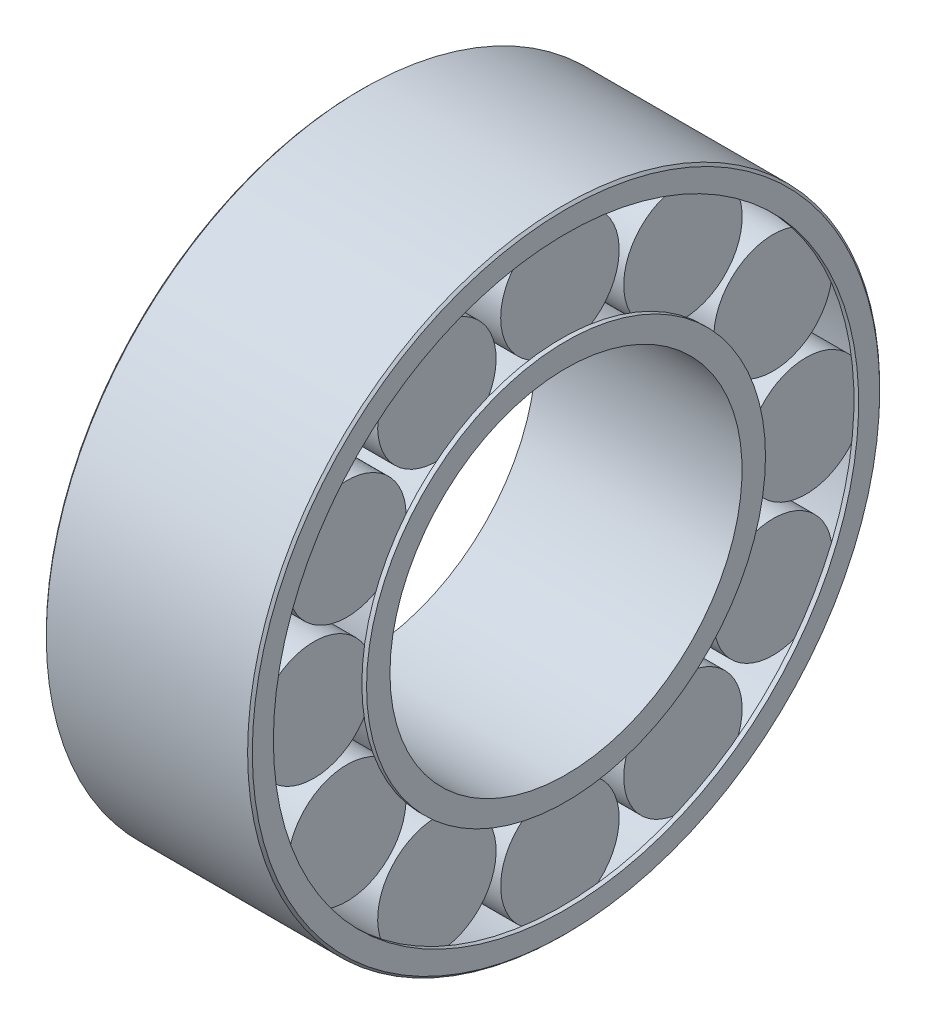
ISO-10303-21;
HEADER;
FILE_DESCRIPTION(('STEP AP214'),'2;1');
FILE_NAME('part.step','',(''),(''),'','','');
FILE_SCHEMA(('AUTOMOTIVE_DESIGN { 1 0 10303 214 1 1 1 1 }'));
ENDSEC;
DATA;
#1=APPLICATION_CONTEXT('core data for automotive mechanical design processes');
#2=APPLICATION_PROTOCOL_DEFINITION('international standard','automotive_design',2000,#1);
#3=PRODUCT_CONTEXT('',#1,'mechanical');
#4=PRODUCT('Part','Part','',(#3));
#5=PRODUCT_RELATED_PRODUCT_CATEGORY('part','',(#4));
#6=PRODUCT_DEFINITION_FORMATION('','',#4);
#7=PRODUCT_DEFINITION_CONTEXT('part definition',#1,'design');
#8=PRODUCT_DEFINITION('design','',#6,#7);
#9=PRODUCT_DEFINITION_SHAPE('','',#8);
#10=(LENGTH_UNIT() NAMED_UNIT(*) SI_UNIT(.MILLI.,.METRE.));
#11=(NAMED_UNIT(*) PLANE_ANGLE_UNIT() SI_UNIT($,.RADIAN.));
#12=(NAMED_UNIT(*) SI_UNIT($,.STERADIAN.) SOLID_ANGLE_UNIT());
#13=UNCERTAINTY_MEASURE_WITH_UNIT(LENGTH_MEASURE(1.E-05),#10,'distance_accuracy_value','');
#14=(GEOMETRIC_REPRESENTATION_CONTEXT(3) GLOBAL_UNCERTAINTY_ASSIGNED_CONTEXT((#13)) GLOBAL_UNIT_ASSIGNED_CONTEXT((#10,
#11,#12)) REPRESENTATION_CONTEXT('',''));
#15=CARTESIAN_POINT('',(0.,0.,0.));
#16=DIRECTION('',(0.,0.,1.));
#17=DIRECTION('',(1.,0.,0.));
#18=AXIS2_PLACEMENT_3D('',#15,#16,#17);
#19=CARTESIAN_POINT('',(1.3,56.4648563267458,-32.5999999999993));
#20=DIRECTION('',(1.,0.,0.));
#21=DIRECTION('',(0.,-0.499999999999989,-0.866025403784445));
#22=AXIS2_PLACEMENT_3D('',#19,#20,#21);
#23=PLANE('',#22);
#24=CARTESIAN_POINT('',(1.3,45.5096349688726,-26.2749999999994));
#25=DIRECTION('',(-1.,0.,0.));
#26=DIRECTION('',(0.,0.499999999999989,0.866025403784445));
#27=AXIS2_PLACEMENT_3D('',#24,#25,#26);
#28=CIRCLE('',#27,12.65);
#29=CARTESIAN_POINT('',(1.3,51.8346349688725,-15.3197786421262));
#30=VERTEX_POINT('',#29);
#31=EDGE_CURVE('E49',#30,#30,#28,.T.);
#32=ORIENTED_EDGE('',*,*,#31,.T.);
#33=EDGE_LOOP('',(#32));
#34=FACE_BOUND('',#33,.T.);
#35=ADVANCED_FACE('F43',(#34),#23,.F.);
#36=CARTESIAN_POINT('',(42.7,56.4648563267458,-32.5999999999993));
#37=DIRECTION('',(-1.,0.,0.));
#38=DIRECTION('',(0.,0.499999999999989,0.866025403784445));
#39=AXIS2_PLACEMENT_3D('',#36,#37,#38);
#40=PLANE('',#39);
#41=CARTESIAN_POINT('',(42.7,45.5096349688726,-26.2749999999994));
#42=DIRECTION('',(-1.,0.,0.));
#43=DIRECTION('',(0.,0.499999999999989,0.866025403784445));
#44=AXIS2_PLACEMENT_3D('',#41,#42,#43);
#45=CIRCLE('',#44,12.65);
#46=CARTESIAN_POINT('',(42.7,51.8346349688725,-15.3197786421262));
#47=VERTEX_POINT('',#46);
#48=EDGE_CURVE('E11',#47,#47,#45,.T.);
#49=ORIENTED_EDGE('',*,*,#48,.F.);
#50=EDGE_LOOP('',(#49));
#51=FACE_BOUND('',#50,.T.);
#52=ADVANCED_FACE('F58',(#51),#40,.F.);
#53=CARTESIAN_POINT('',(1.3,45.5096349688726,-26.2749999999994));
#54=DIRECTION('',(-1.,0.,0.));
#55=DIRECTION('',(0.,0.499999999999989,0.866025403784445));
#56=AXIS2_PLACEMENT_3D('',#53,#54,#55);
#57=CYLINDRICAL_SURFACE('',#56,12.65);
#58=ORIENTED_EDGE('',*,*,#31,.F.);
#59=EDGE_LOOP('',(#58));
#60=FACE_BOUND('',#59,.T.);
#61=ORIENTED_EDGE('',*,*,#48,.T.);
#62=EDGE_LOOP('',(#61));
#63=FACE_BOUND('',#62,.T.);
#64=ADVANCED_FACE('F56',(#60,#63),#57,.T.);
#65=CLOSED_SHELL('',(#35,#52,#64));
#66=MANIFOLD_SOLID_BREP('B2',#65);
#67=CARTESIAN_POINT('',(1.3,32.6000000000007,-56.464856326745));
#68=DIRECTION('',(1.,0.,0.));
#69=DIRECTION('',(0.,-0.866025403784433,-0.50000000000001));
#70=AXIS2_PLACEMENT_3D('',#67,#68,#69);
#71=PLANE('',#70);
#72=CARTESIAN_POINT('',(1.3,26.2750000000005,-45.509634968872));
#73=DIRECTION('',(-1.,0.,0.));
#74=DIRECTION('',(0.,0.866025403784433,0.50000000000001));
#75=AXIS2_PLACEMENT_3D('',#72,#73,#74);
#76=CIRCLE('',#75,12.65);
#77=CARTESIAN_POINT('',(1.3,37.2302213578736,-39.1846349688718));
#78=VERTEX_POINT('',#77);
#79=EDGE_CURVE('E97',#78,#78,#76,.T.);
#80=ORIENTED_EDGE('',*,*,#79,.T.);
#81=EDGE_LOOP('',(#80));
#82=FACE_BOUND('',#81,.T.);
#83=ADVANCED_FACE('F91',(#82),#71,.F.);
#84=CARTESIAN_POINT('',(42.7,32.6000000000007,-56.464856326745));
#85=DIRECTION('',(-1.,0.,0.));
#86=DIRECTION('',(0.,0.866025403784433,0.50000000000001));
#87=AXIS2_PLACEMENT_3D('',#84,#85,#86);
#88=PLANE('',#87);
#89=CARTESIAN_POINT('',(42.7,26.2750000000005,-45.509634968872));
#90=DIRECTION('',(-1.,0.,0.));
#91=DIRECTION('',(0.,0.866025403784433,0.50000000000001));
#92=AXIS2_PLACEMENT_3D('',#89,#90,#91);
#93=CIRCLE('',#92,12.65);
#94=CARTESIAN_POINT('',(42.7,37.2302213578736,-39.1846349688718));
#95=VERTEX_POINT('',#94);
#96=EDGE_CURVE('E42',#95,#95,#93,.T.);
#97=ORIENTED_EDGE('',*,*,#96,.F.);
#98=EDGE_LOOP('',(#97));
#99=FACE_BOUND('',#98,.T.);
#100=ADVANCED_FACE('F106',(#99),#88,.F.);
#101=CARTESIAN_POINT('',(1.3,26.2750000000005,-45.509634968872));
#102=DIRECTION('',(-1.,0.,0.));
#103=DIRECTION('',(0.,0.866025403784433,0.50000000000001));
#104=AXIS2_PLACEMENT_3D('',#101,#102,#103);
#105=CYLINDRICAL_SURFACE('',#104,12.65);
#106=ORIENTED_EDGE('',*,*,#79,.F.);
#107=EDGE_LOOP('',(#106));
#108=FACE_BOUND('',#107,.T.);
#109=ORIENTED_EDGE('',*,*,#96,.T.);
#110=EDGE_LOOP('',(#109));
#111=FACE_BOUND('',#110,.T.);
#112=ADVANCED_FACE('F104',(#108,#111),#105,.T.);
#113=CLOSED_SHELL('',(#83,#100,#112));
#114=MANIFOLD_SOLID_BREP('B6',#113);
#115=CARTESIAN_POINT('',(1.3,6.82933749877717E-13,-65.2));
#116=DIRECTION('',(1.,0.,0.));
#117=DIRECTION('',(0.,-1.,0.));
#118=AXIS2_PLACEMENT_3D('',#115,#116,#117);
#119=PLANE('',#118);
#120=CARTESIAN_POINT('',(1.3,5.5043203306862E-13,-52.55));
#121=DIRECTION('',(-1.,0.,0.));
#122=DIRECTION('',(0.,1.,0.));
#123=AXIS2_PLACEMENT_3D('',#120,#121,#122);
#124=CIRCLE('',#123,12.65);
#125=CARTESIAN_POINT('',(1.3,12.6500000000005,-52.5499999999999));
#126=VERTEX_POINT('',#125);
#127=EDGE_CURVE('E145',#126,#126,#124,.T.);
#128=ORIENTED_EDGE('',*,*,#127,.T.);
#129=EDGE_LOOP('',(#128));
#130=FACE_BOUND('',#129,.T.);
#131=ADVANCED_FACE('F139',(#130),#119,.F.);
#132=CARTESIAN_POINT('',(42.7,6.82933749877717E-13,-65.2));
#133=DIRECTION('',(-1.,0.,0.));
#134=DIRECTION('',(0.,1.,0.));
#135=AXIS2_PLACEMENT_3D('',#132,#133,#134);
#136=PLANE('',#135);
#137=CARTESIAN_POINT('',(42.7,5.5043203306862E-13,-52.55));
#138=DIRECTION('',(-1.,0.,0.));
#139=DIRECTION('',(0.,1.,0.));
#140=AXIS2_PLACEMENT_3D('',#137,#138,#139);
#141=CIRCLE('',#140,12.65);
#142=CARTESIAN_POINT('',(42.7,12.6500000000005,-52.5499999999999));
#143=VERTEX_POINT('',#142);
#144=EDGE_CURVE('E90',#143,#143,#141,.T.);
#145=ORIENTED_EDGE('',*,*,#144,.F.);
#146=EDGE_LOOP('',(#145));
#147=FACE_BOUND('',#146,.T.);
#148=ADVANCED_FACE('F154',(#147),#136,.F.);
#149=CARTESIAN_POINT('',(1.3,5.5043203306862E-13,-52.55));
#150=DIRECTION('',(-1.,0.,0.));
#151=DIRECTION('',(0.,1.,0.));
#152=AXIS2_PLACEMENT_3D('',#149,#150,#151);
#153=CYLINDRICAL_SURFACE('',#152,12.65);
#154=ORIENTED_EDGE('',*,*,#127,.F.);
#155=EDGE_LOOP('',(#154));
#156=FACE_BOUND('',#155,.T.);
#157=ORIENTED_EDGE('',*,*,#144,.T.);
#158=EDGE_LOOP('',(#157));
#159=FACE_BOUND('',#158,.T.);
#160=ADVANCED_FACE('F152',(#156,#159),#153,.T.);
#161=CLOSED_SHELL('',(#131,#148,#160));
#162=MANIFOLD_SOLID_BREP('B37',#161);
#163=CARTESIAN_POINT('',(1.3,-32.5999999999995,-56.4648563267457));
#164=DIRECTION('',(1.,0.,0.));
#165=DIRECTION('',(0.,-0.866025403784443,0.499999999999992));
#166=AXIS2_PLACEMENT_3D('',#163,#164,#165);
#167=PLANE('',#166);
#168=CARTESIAN_POINT('',(1.3,-26.2749999999996,-45.5096349688725));
#169=DIRECTION('',(-1.,0.,0.));
#170=DIRECTION('',(0.,0.866025403784443,-0.499999999999992));
#171=AXIS2_PLACEMENT_3D('',#168,#169,#170);
#172=CIRCLE('',#171,12.65);
#173=CARTESIAN_POINT('',(1.3,-15.3197786421264,-51.8346349688724));
#174=VERTEX_POINT('',#173);
#175=EDGE_CURVE('E193',#174,#174,#172,.T.);
#176=ORIENTED_EDGE('',*,*,#175,.T.);
#177=EDGE_LOOP('',(#176));
#178=FACE_BOUND('',#177,.T.);
#179=ADVANCED_FACE('F187',(#178),#167,.F.);
#180=CARTESIAN_POINT('',(42.7,-32.5999999999995,-56.4648563267457));
#181=DIRECTION('',(-1.,0.,0.));
#182=DIRECTION('',(0.,0.866025403784443,-0.499999999999992));
#183=AXIS2_PLACEMENT_3D('',#180,#181,#182);
#184=PLANE('',#183);
#185=CARTESIAN_POINT('',(42.7,-26.2749999999996,-45.5096349688725));
#186=DIRECTION('',(-1.,0.,0.));
#187=DIRECTION('',(0.,0.866025403784443,-0.499999999999992));
#188=AXIS2_PLACEMENT_3D('',#185,#186,#187);
#189=CIRCLE('',#188,12.65);
#190=CARTESIAN_POINT('',(42.7,-15.3197786421264,-51.8346349688724));
#191=VERTEX_POINT('',#190);
#192=EDGE_CURVE('E138',#191,#191,#189,.T.);
#193=ORIENTED_EDGE('',*,*,#192,.F.);
#194=EDGE_LOOP('',(#193));
#195=FACE_BOUND('',#194,.T.);
#196=ADVANCED_FACE('F202',(#195),#184,.F.);
#197=CARTESIAN_POINT('',(1.3,-26.2749999999996,-45.5096349688725));
#198=DIRECTION('',(-1.,0.,0.));
#199=DIRECTION('',(0.,0.866025403784443,-0.499999999999992));
#200=AXIS2_PLACEMENT_3D('',#197,#198,#199);
#201=CYLINDRICAL_SURFACE('',#200,12.65);
#202=ORIENTED_EDGE('',*,*,#175,.F.);
#203=EDGE_LOOP('',(#202));
#204=FACE_BOUND('',#203,.T.);
#205=ORIENTED_EDGE('',*,*,#192,.T.);
#206=EDGE_LOOP('',(#205));
#207=FACE_BOUND('',#206,.T.);
#208=ADVANCED_FACE('F200',(#204,#207),#201,.T.);
#209=CLOSED_SHELL('',(#179,#196,#208));
#210=MANIFOLD_SOLID_BREP('B85',#209);
#211=CARTESIAN_POINT('',(1.3,-56.4648563267451,-32.6000000000005));
#212=DIRECTION('',(1.,0.,0.));
#213=DIRECTION('',(0.,-0.500000000000007,0.866025403784435));
#214=AXIS2_PLACEMENT_3D('',#211,#212,#213);
#215=PLANE('',#214);
#216=CARTESIAN_POINT('',(1.3,-45.509634968872,-26.2750000000004));
#217=DIRECTION('',(-1.,0.,0.));
#218=DIRECTION('',(0.,0.500000000000007,-0.866025403784435));
#219=AXIS2_PLACEMENT_3D('',#216,#217,#218);
#220=CIRCLE('',#219,12.65);
#221=CARTESIAN_POINT('',(1.3,-39.184634968872,-37.2302213578735));
#222=VERTEX_POINT('',#221);
#223=EDGE_CURVE('E241',#222,#222,#220,.T.);
#224=ORIENTED_EDGE('',*,*,#223,.T.);
#225=EDGE_LOOP('',(#224));
#226=FACE_BOUND('',#225,.T.);
#227=ADVANCED_FACE('F235',(#226),#215,.F.);
#228=CARTESIAN_POINT('',(42.7,-56.4648563267451,-32.6000000000005));
#229=DIRECTION('',(-1.,0.,0.));
#230=DIRECTION('',(0.,0.500000000000007,-0.866025403784435));
#231=AXIS2_PLACEMENT_3D('',#228,#229,#230);
#232=PLANE('',#231);
#233=CARTESIAN_POINT('',(42.7,-45.509634968872,-26.2750000000004));
#234=DIRECTION('',(-1.,0.,0.));
#235=DIRECTION('',(0.,0.500000000000007,-0.866025403784435));
#236=AXIS2_PLACEMENT_3D('',#233,#234,#235);
#237=CIRCLE('',#236,12.65);
#238=CARTESIAN_POINT('',(42.7,-39.184634968872,-37.2302213578735));
#239=VERTEX_POINT('',#238);
#240=EDGE_CURVE('E186',#239,#239,#237,.T.);
#241=ORIENTED_EDGE('',*,*,#240,.F.);
#242=EDGE_LOOP('',(#241));
#243=FACE_BOUND('',#242,.T.);
#244=ADVANCED_FACE('F250',(#243),#232,.F.);
#245=CARTESIAN_POINT('',(1.3,-45.509634968872,-26.2750000000004));
#246=DIRECTION('',(-1.,0.,0.));
#247=DIRECTION('',(0.,0.500000000000007,-0.866025403784435));
#248=AXIS2_PLACEMENT_3D('',#245,#246,#247);
#249=CYLINDRICAL_SURFACE('',#248,12.65);
#250=ORIENTED_EDGE('',*,*,#223,.F.);
#251=EDGE_LOOP('',(#250));
#252=FACE_BOUND('',#251,.T.);
#253=ORIENTED_EDGE('',*,*,#240,.T.);
#254=EDGE_LOOP('',(#253));
#255=FACE_BOUND('',#254,.T.);
#256=ADVANCED_FACE('F248',(#252,#255),#249,.T.);
#257=CLOSED_SHELL('',(#227,#244,#256));
#258=MANIFOLD_SOLID_BREP('B133',#257);
#259=CARTESIAN_POINT('',(1.3,-65.2,0.));
#260=DIRECTION('',(1.,0.,0.));
#261=DIRECTION('',(0.,0.,1.));
#262=AXIS2_PLACEMENT_3D('',#259,#260,#261);
#263=PLANE('',#262);
#264=CARTESIAN_POINT('',(1.3,-52.55,0.));
#265=DIRECTION('',(-1.,0.,0.));
#266=DIRECTION('',(0.,0.,-1.));
#267=AXIS2_PLACEMENT_3D('',#264,#265,#266);
#268=CIRCLE('',#267,12.65);
#269=CARTESIAN_POINT('',(1.3,-52.55,-12.65));
#270=VERTEX_POINT('',#269);
#271=EDGE_CURVE('E289',#270,#270,#268,.T.);
#272=ORIENTED_EDGE('',*,*,#271,.T.);
#273=EDGE_LOOP('',(#272));
#274=FACE_BOUND('',#273,.T.);
#275=ADVANCED_FACE('F283',(#274),#263,.F.);
#276=CARTESIAN_POINT('',(42.7,-65.2,0.));
#277=DIRECTION('',(-1.,0.,0.));
#278=DIRECTION('',(0.,0.,-1.));
#279=AXIS2_PLACEMENT_3D('',#276,#277,#278);
#280=PLANE('',#279);
#281=CARTESIAN_POINT('',(42.7,-52.55,0.));
#282=DIRECTION('',(-1.,0.,0.));
#283=DIRECTION('',(0.,0.,-1.));
#284=AXIS2_PLACEMENT_3D('',#281,#282,#283);
#285=CIRCLE('',#284,12.65);
#286=CARTESIAN_POINT('',(42.7,-52.55,-12.65));
#287=VERTEX_POINT('',#286);
#288=EDGE_CURVE('E234',#287,#287,#285,.T.);
#289=ORIENTED_EDGE('',*,*,#288,.F.);
#290=EDGE_LOOP('',(#289));
#291=FACE_BOUND('',#290,.T.);
#292=ADVANCED_FACE('F298',(#291),#280,.F.);
#293=CARTESIAN_POINT('',(1.3,-52.55,0.));
#294=DIRECTION('',(-1.,0.,0.));
#295=DIRECTION('',(0.,0.,-1.));
#296=AXIS2_PLACEMENT_3D('',#293,#294,#295);
#297=CYLINDRICAL_SURFACE('',#296,12.65);
#298=ORIENTED_EDGE('',*,*,#271,.F.);
#299=EDGE_LOOP('',(#298));
#300=FACE_BOUND('',#299,.T.);
#301=ORIENTED_EDGE('',*,*,#288,.T.);
#302=EDGE_LOOP('',(#301));
#303=FACE_BOUND('',#302,.T.);
#304=ADVANCED_FACE('F296',(#300,#303),#297,.T.);
#305=CLOSED_SHELL('',(#275,#292,#304));
#306=MANIFOLD_SOLID_BREP('B181',#305);
#307=CARTESIAN_POINT('',(1.3,-56.4648563267456,32.5999999999997));
#308=DIRECTION('',(1.,0.,0.));
#309=DIRECTION('',(0.,0.499999999999995,0.866025403784442));
#310=AXIS2_PLACEMENT_3D('',#307,#308,#309);
#311=PLANE('',#310);
#312=CARTESIAN_POINT('',(1.3,-45.5096349688724,26.2749999999997));
#313=DIRECTION('',(-1.,0.,0.));
#314=DIRECTION('',(0.,-0.499999999999995,-0.866025403784442));
#315=AXIS2_PLACEMENT_3D('',#312,#313,#314);
#316=CIRCLE('',#315,12.65);
#317=CARTESIAN_POINT('',(1.3,-51.8346349688724,15.3197786421266));
#318=VERTEX_POINT('',#317);
#319=EDGE_CURVE('E337',#318,#318,#316,.T.);
#320=ORIENTED_EDGE('',*,*,#319,.T.);
#321=EDGE_LOOP('',(#320));
#322=FACE_BOUND('',#321,.T.);
#323=ADVANCED_FACE('F331',(#322),#311,.F.);
#324=CARTESIAN_POINT('',(42.7,-56.4648563267456,32.5999999999997));
#325=DIRECTION('',(-1.,0.,0.));
#326=DIRECTION('',(0.,-0.499999999999995,-0.866025403784442));
#327=AXIS2_PLACEMENT_3D('',#324,#325,#326);
#328=PLANE('',#327);
#329=CARTESIAN_POINT('',(42.7,-45.5096349688724,26.2749999999997));
#330=DIRECTION('',(-1.,0.,0.));
#331=DIRECTION('',(0.,-0.499999999999995,-0.866025403784442));
#332=AXIS2_PLACEMENT_3D('',#329,#330,#331);
#333=CIRCLE('',#332,12.65);
#334=CARTESIAN_POINT('',(42.7,-51.8346349688724,15.3197786421266));
#335=VERTEX_POINT('',#334);
#336=EDGE_CURVE('E282',#335,#335,#333,.T.);
#337=ORIENTED_EDGE('',*,*,#336,.F.);
#338=EDGE_LOOP('',(#337));
#339=FACE_BOUND('',#338,.T.);
#340=ADVANCED_FACE('F346',(#339),#328,.F.);
#341=CARTESIAN_POINT('',(1.3,-45.5096349688724,26.2749999999997));
#342=DIRECTION('',(-1.,0.,0.));
#343=DIRECTION('',(0.,-0.499999999999995,-0.866025403784442));
#344=AXIS2_PLACEMENT_3D('',#341,#342,#343);
#345=CYLINDRICAL_SURFACE('',#344,12.65);
#346=ORIENTED_EDGE('',*,*,#319,.F.);
#347=EDGE_LOOP('',(#346));
#348=FACE_BOUND('',#347,.T.);
#349=ORIENTED_EDGE('',*,*,#336,.T.);
#350=EDGE_LOOP('',(#349));
#351=FACE_BOUND('',#350,.T.);
#352=ADVANCED_FACE('F344',(#348,#351),#345,.T.);
#353=CLOSED_SHELL('',(#323,#340,#352));
#354=MANIFOLD_SOLID_BREP('B229',#353);
#355=CARTESIAN_POINT('',(1.3,-32.6000000000003,56.4648563267453));
#356=DIRECTION('',(1.,0.,0.));
#357=DIRECTION('',(0.,0.866025403784436,0.500000000000004));
#358=AXIS2_PLACEMENT_3D('',#355,#356,#357);
#359=PLANE('',#358);
#360=CARTESIAN_POINT('',(1.3,-26.2750000000002,45.5096349688721));
#361=DIRECTION('',(-1.,0.,0.));
#362=DIRECTION('',(0.,-0.866025403784436,-0.500000000000004));
#363=AXIS2_PLACEMENT_3D('',#360,#361,#362);
#364=CIRCLE('',#363,12.65);
#365=CARTESIAN_POINT('',(1.3,-37.2302213578733,39.1846349688721));
#366=VERTEX_POINT('',#365);
#367=EDGE_CURVE('E385',#366,#366,#364,.T.);
#368=ORIENTED_EDGE('',*,*,#367,.T.);
#369=EDGE_LOOP('',(#368));
#370=FACE_BOUND('',#369,.T.);
#371=ADVANCED_FACE('F379',(#370),#359,.F.);
#372=CARTESIAN_POINT('',(42.7,-32.6000000000003,56.4648563267453));
#373=DIRECTION('',(-1.,0.,0.));
#374=DIRECTION('',(0.,-0.866025403784436,-0.500000000000004));
#375=AXIS2_PLACEMENT_3D('',#372,#373,#374);
#376=PLANE('',#375);
#377=CARTESIAN_POINT('',(42.7,-26.2750000000002,45.5096349688721));
#378=DIRECTION('',(-1.,0.,0.));
#379=DIRECTION('',(0.,-0.866025403784436,-0.500000000000004));
#380=AXIS2_PLACEMENT_3D('',#377,#378,#379);
#381=CIRCLE('',#380,12.65);
#382=CARTESIAN_POINT('',(42.7,-37.2302213578733,39.1846349688721));
#383=VERTEX_POINT('',#382);
#384=EDGE_CURVE('E330',#383,#383,#381,.T.);
#385=ORIENTED_EDGE('',*,*,#384,.F.);
#386=EDGE_LOOP('',(#385));
#387=FACE_BOUND('',#386,.T.);
#388=ADVANCED_FACE('F394',(#387),#376,.F.);
#389=CARTESIAN_POINT('',(1.3,-26.2750000000002,45.5096349688721));
#390=DIRECTION('',(-1.,0.,0.));
#391=DIRECTION('',(0.,-0.866025403784436,-0.500000000000004));
#392=AXIS2_PLACEMENT_3D('',#389,#390,#391);
#393=CYLINDRICAL_SURFACE('',#392,12.65);
#394=ORIENTED_EDGE('',*,*,#367,.F.);
#395=EDGE_LOOP('',(#394));
#396=FACE_BOUND('',#395,.T.);
#397=ORIENTED_EDGE('',*,*,#384,.T.);
#398=EDGE_LOOP('',(#397));
#399=FACE_BOUND('',#398,.T.);
#400=ADVANCED_FACE('F392',(#396,#399),#393,.T.);
#401=CLOSED_SHELL('',(#371,#388,#400));
#402=MANIFOLD_SOLID_BREP('B277',#401);
#403=CARTESIAN_POINT('',(1.3,-2.27644583292572E-13,65.2));
#404=DIRECTION('',(1.,0.,0.));
#405=DIRECTION('',(0.,1.,0.));
#406=AXIS2_PLACEMENT_3D('',#403,#404,#405);
#407=PLANE('',#406);
#408=CARTESIAN_POINT('',(1.3,-1.83477344356207E-13,52.55));
#409=DIRECTION('',(-1.,0.,0.));
#410=DIRECTION('',(0.,-1.,0.));
#411=AXIS2_PLACEMENT_3D('',#408,#409,#410);
#412=CIRCLE('',#411,12.65);
#413=CARTESIAN_POINT('',(1.3,-12.6500000000002,52.55));
#414=VERTEX_POINT('',#413);
#415=EDGE_CURVE('E433',#414,#414,#412,.T.);
#416=ORIENTED_EDGE('',*,*,#415,.T.);
#417=EDGE_LOOP('',(#416));
#418=FACE_BOUND('',#417,.T.);
#419=ADVANCED_FACE('F427',(#418),#407,.F.);
#420=CARTESIAN_POINT('',(42.7,-2.27644583292572E-13,65.2));
#421=DIRECTION('',(-1.,0.,0.));
#422=DIRECTION('',(0.,-1.,0.));
#423=AXIS2_PLACEMENT_3D('',#420,#421,#422);
#424=PLANE('',#423);
#425=CARTESIAN_POINT('',(42.7,-1.83477344356207E-13,52.55));
#426=DIRECTION('',(-1.,0.,0.));
#427=DIRECTION('',(0.,-1.,0.));
#428=AXIS2_PLACEMENT_3D('',#425,#426,#427);
#429=CIRCLE('',#428,12.65);
#430=CARTESIAN_POINT('',(42.7,-12.6500000000002,52.55));
#431=VERTEX_POINT('',#430);
#432=EDGE_CURVE('E378',#431,#431,#429,.T.);
#433=ORIENTED_EDGE('',*,*,#432,.F.);
#434=EDGE_LOOP('',(#433));
#435=FACE_BOUND('',#434,.T.);
#436=ADVANCED_FACE('F442',(#435),#424,.F.);
#437=CARTESIAN_POINT('',(1.3,-1.83477344356207E-13,52.55));
#438=DIRECTION('',(-1.,0.,0.));
#439=DIRECTION('',(0.,-1.,0.));
#440=AXIS2_PLACEMENT_3D('',#437,#438,#439);
#441=CYLINDRICAL_SURFACE('',#440,12.65);
#442=ORIENTED_EDGE('',*,*,#415,.F.);
#443=EDGE_LOOP('',(#442));
#444=FACE_BOUND('',#443,.T.);
#445=ORIENTED_EDGE('',*,*,#432,.T.);
#446=EDGE_LOOP('',(#445));
#447=FACE_BOUND('',#446,.T.);
#448=ADVANCED_FACE('F440',(#444,#447),#441,.T.);
#449=CLOSED_SHELL('',(#419,#436,#448));
#450=MANIFOLD_SOLID_BREP('B325',#449);
#451=CARTESIAN_POINT('',(1.3,32.5999999999999,56.4648563267455));
#452=DIRECTION('',(1.,0.,0.));
#453=DIRECTION('',(0.,0.86602540378444,-0.499999999999998));
#454=AXIS2_PLACEMENT_3D('',#451,#452,#453);
#455=PLANE('',#454);
#456=CARTESIAN_POINT('',(1.3,26.2749999999999,45.5096349688723));
#457=DIRECTION('',(-1.,0.,0.));
#458=DIRECTION('',(0.,-0.86602540378444,0.499999999999998));
#459=AXIS2_PLACEMENT_3D('',#456,#457,#458);
#460=CIRCLE('',#459,12.65);
#461=CARTESIAN_POINT('',(1.3,15.3197786421267,51.8346349688723));
#462=VERTEX_POINT('',#461);
#463=EDGE_CURVE('E481',#462,#462,#460,.T.);
#464=ORIENTED_EDGE('',*,*,#463,.T.);
#465=EDGE_LOOP('',(#464));
#466=FACE_BOUND('',#465,.T.);
#467=ADVANCED_FACE('F475',(#466),#455,.F.);
#468=CARTESIAN_POINT('',(42.7,32.5999999999999,56.4648563267455));
#469=DIRECTION('',(-1.,0.,0.));
#470=DIRECTION('',(0.,-0.86602540378444,0.499999999999998));
#471=AXIS2_PLACEMENT_3D('',#468,#469,#470);
#472=PLANE('',#471);
#473=CARTESIAN_POINT('',(42.7,26.2749999999999,45.5096349688723));
#474=DIRECTION('',(-1.,0.,0.));
#475=DIRECTION('',(0.,-0.86602540378444,0.499999999999998));
#476=AXIS2_PLACEMENT_3D('',#473,#474,#475);
#477=CIRCLE('',#476,12.65);
#478=CARTESIAN_POINT('',(42.7,15.3197786421267,51.8346349688723));
#479=VERTEX_POINT('',#478);
#480=EDGE_CURVE('E426',#479,#479,#477,.T.);
#481=ORIENTED_EDGE('',*,*,#480,.F.);
#482=EDGE_LOOP('',(#481));
#483=FACE_BOUND('',#482,.T.);
#484=ADVANCED_FACE('F490',(#483),#472,.F.);
#485=CARTESIAN_POINT('',(1.3,26.2749999999999,45.5096349688723));
#486=DIRECTION('',(-1.,0.,0.));
#487=DIRECTION('',(0.,-0.86602540378444,0.499999999999998));
#488=AXIS2_PLACEMENT_3D('',#485,#486,#487);
#489=CYLINDRICAL_SURFACE('',#488,12.65);
#490=ORIENTED_EDGE('',*,*,#463,.F.);
#491=EDGE_LOOP('',(#490));
#492=FACE_BOUND('',#491,.T.);
#493=ORIENTED_EDGE('',*,*,#480,.T.);
#494=EDGE_LOOP('',(#493));
#495=FACE_BOUND('',#494,.T.);
#496=ADVANCED_FACE('F488',(#492,#495),#489,.T.);
#497=CLOSED_SHELL('',(#467,#484,#496));
#498=MANIFOLD_SOLID_BREP('B373',#497);
#499=CARTESIAN_POINT('',(1.3,56.4648563267454,32.6000000000001));
#500=DIRECTION('',(1.,0.,0.));
#501=DIRECTION('',(0.,0.500000000000001,-0.866025403784438));
#502=AXIS2_PLACEMENT_3D('',#499,#500,#501);
#503=PLANE('',#502);
#504=CARTESIAN_POINT('',(1.3,45.5096349688722,26.2750000000001));
#505=DIRECTION('',(-1.,0.,0.));
#506=DIRECTION('',(0.,-0.500000000000001,0.866025403784438));
#507=AXIS2_PLACEMENT_3D('',#504,#505,#506);
#508=CIRCLE('',#507,12.65);
#509=CARTESIAN_POINT('',(1.3,39.1846349688722,37.2302213578732));
#510=VERTEX_POINT('',#509);
#511=EDGE_CURVE('E529',#510,#510,#508,.T.);
#512=ORIENTED_EDGE('',*,*,#511,.T.);
#513=EDGE_LOOP('',(#512));
#514=FACE_BOUND('',#513,.T.);
#515=ADVANCED_FACE('F523',(#514),#503,.F.);
#516=CARTESIAN_POINT('',(42.7,56.4648563267454,32.6000000000001));
#517=DIRECTION('',(-1.,0.,0.));
#518=DIRECTION('',(0.,-0.500000000000001,0.866025403784438));
#519=AXIS2_PLACEMENT_3D('',#516,#517,#518);
#520=PLANE('',#519);
#521=CARTESIAN_POINT('',(42.7,45.5096349688722,26.2750000000001));
#522=DIRECTION('',(-1.,0.,0.));
#523=DIRECTION('',(0.,-0.500000000000001,0.866025403784438));
#524=AXIS2_PLACEMENT_3D('',#521,#522,#523);
#525=CIRCLE('',#524,12.65);
#526=CARTESIAN_POINT('',(42.7,39.1846349688722,37.2302213578732));
#527=VERTEX_POINT('',#526);
#528=EDGE_CURVE('E474',#527,#527,#525,.T.);
#529=ORIENTED_EDGE('',*,*,#528,.F.);
#530=EDGE_LOOP('',(#529));
#531=FACE_BOUND('',#530,.T.);
#532=ADVANCED_FACE('F538',(#531),#520,.F.);
#533=CARTESIAN_POINT('',(1.3,45.5096349688722,26.2750000000001));
#534=DIRECTION('',(-1.,0.,0.));
#535=DIRECTION('',(0.,-0.500000000000001,0.866025403784438));
#536=AXIS2_PLACEMENT_3D('',#533,#534,#535);
#537=CYLINDRICAL_SURFACE('',#536,12.65);
#538=ORIENTED_EDGE('',*,*,#511,.F.);
#539=EDGE_LOOP('',(#538));
#540=FACE_BOUND('',#539,.T.);
#541=ORIENTED_EDGE('',*,*,#528,.T.);
#542=EDGE_LOOP('',(#541));
#543=FACE_BOUND('',#542,.T.);
#544=ADVANCED_FACE('F536',(#540,#543),#537,.T.);
#545=CLOSED_SHELL('',(#515,#532,#544));
#546=MANIFOLD_SOLID_BREP('B421',#545);
#547=CARTESIAN_POINT('',(1.3,65.2,0.));
#548=DIRECTION('',(1.,0.,0.));
#549=DIRECTION('',(0.,0.,-1.));
#550=AXIS2_PLACEMENT_3D('',#547,#548,#549);
#551=PLANE('',#550);
#552=CARTESIAN_POINT('',(1.3,52.55,0.));
#553=DIRECTION('',(-1.,0.,0.));
#554=DIRECTION('',(0.,0.,1.));
#555=AXIS2_PLACEMENT_3D('',#552,#553,#554);
#556=CIRCLE('',#555,12.65);
#557=CARTESIAN_POINT('',(1.3,52.55,12.65));
#558=VERTEX_POINT('',#557);
#559=EDGE_CURVE('E577',#558,#558,#556,.T.);
#560=ORIENTED_EDGE('',*,*,#559,.T.);
#561=EDGE_LOOP('',(#560));
#562=FACE_BOUND('',#561,.T.);
#563=ADVANCED_FACE('F571',(#562),#551,.F.);
#564=CARTESIAN_POINT('',(42.7,65.2,0.));
#565=DIRECTION('',(-1.,0.,0.));
#566=DIRECTION('',(0.,0.,1.));
#567=AXIS2_PLACEMENT_3D('',#564,#565,#566);
#568=PLANE('',#567);
#569=CARTESIAN_POINT('',(42.7,52.55,0.));
#570=DIRECTION('',(-1.,0.,0.));
#571=DIRECTION('',(0.,0.,1.));
#572=AXIS2_PLACEMENT_3D('',#569,#570,#571);
#573=CIRCLE('',#572,12.65);
#574=CARTESIAN_POINT('',(42.7,52.55,12.65));
#575=VERTEX_POINT('',#574);
#576=EDGE_CURVE('E522',#575,#575,#573,.T.);
#577=ORIENTED_EDGE('',*,*,#576,.F.);
#578=EDGE_LOOP('',(#577));
#579=FACE_BOUND('',#578,.T.);
#580=ADVANCED_FACE('F586',(#579),#568,.F.);
#581=CARTESIAN_POINT('',(1.3,52.55,0.));
#582=DIRECTION('',(-1.,0.,0.));
#583=DIRECTION('',(0.,0.,1.));
#584=AXIS2_PLACEMENT_3D('',#581,#582,#583);
#585=CYLINDRICAL_SURFACE('',#584,12.65);
#586=ORIENTED_EDGE('',*,*,#559,.F.);
#587=EDGE_LOOP('',(#586));
#588=FACE_BOUND('',#587,.T.);
#589=ORIENTED_EDGE('',*,*,#576,.T.);
#590=EDGE_LOOP('',(#589));
#591=FACE_BOUND('',#590,.T.);
#592=ADVANCED_FACE('F584',(#588,#591),#585,.T.);
#593=CLOSED_SHELL('',(#563,#580,#592));
#594=MANIFOLD_SOLID_BREP('B469',#593);
#595=CARTESIAN_POINT('',(0.,67.5,0.));
#596=DIRECTION('',(1.,0.,0.));
#597=DIRECTION('',(0.,0.,-1.));
#598=AXIS2_PLACEMENT_3D('',#595,#596,#597);
#599=PLANE('',#598);
#600=CARTESIAN_POINT('',(0.,0.,0.));
#601=DIRECTION('',(1.,0.,0.));
#602=DIRECTION('',(0.,0.,-1.));
#603=AXIS2_PLACEMENT_3D('',#600,#601,#602);
#604=CIRCLE('',#603,67.);
#605=CARTESIAN_POINT('',(0.,0.,-67.));
#606=VERTEX_POINT('',#605);
#607=EDGE_CURVE('E570',#606,#606,#604,.F.);
#608=ORIENTED_EDGE('',*,*,#607,.T.);
#609=EDGE_LOOP('',(#608));
#610=FACE_BOUND('',#609,.T.);
#611=CARTESIAN_POINT('',(0.,0.,0.));
#612=DIRECTION('',(-1.,0.,0.));
#613=DIRECTION('',(0.,0.,1.));
#614=AXIS2_PLACEMENT_3D('',#611,#612,#613);
#615=CIRCLE('',#614,62.5);
#616=CARTESIAN_POINT('',(0.,0.,62.5));
#617=VERTEX_POINT('',#616);
#618=EDGE_CURVE('E640',#617,#617,#615,.T.);
#619=ORIENTED_EDGE('',*,*,#618,.F.);
#620=EDGE_LOOP('',(#619));
#621=FACE_BOUND('',#620,.T.);
#622=ADVANCED_FACE('F619',(#610,#621),#599,.F.);
#623=CARTESIAN_POINT('',(0.,0.,0.));
#624=DIRECTION('',(-1.,0.,0.));
#625=DIRECTION('',(0.,0.,1.));
#626=AXIS2_PLACEMENT_3D('',#623,#624,#625);
#627=CYLINDRICAL_SURFACE('',#626,62.5);
#628=CARTESIAN_POINT('',(0.999999999999997,0.,0.));
#629=DIRECTION('',(-1.,0.,0.));
#630=DIRECTION('',(0.,0.,1.));
#631=AXIS2_PLACEMENT_3D('',#628,#629,#630);
#632=CIRCLE('',#631,62.5);
#633=CARTESIAN_POINT('',(0.999999999999997,0.,62.5));
#634=VERTEX_POINT('',#633);
#635=EDGE_CURVE('E643',#634,#634,#632,.T.);
#636=ORIENTED_EDGE('',*,*,#635,.F.);
#637=EDGE_LOOP('',(#636));
#638=FACE_BOUND('',#637,.T.);
#639=ORIENTED_EDGE('',*,*,#618,.T.);
#640=EDGE_LOOP('',(#639));
#641=FACE_BOUND('',#640,.T.);
#642=ADVANCED_FACE('F682',(#638,#641),#627,.F.);
#643=CARTESIAN_POINT('',(0.999999999999997,62.5,0.));
#644=DIRECTION('',(-1.,0.,0.));
#645=DIRECTION('',(0.,0.,1.));
#646=AXIS2_PLACEMENT_3D('',#643,#644,#645);
#647=PLANE('',#646);
#648=CARTESIAN_POINT('',(0.999999999999998,0.,0.));
#649=DIRECTION('',(-1.,0.,0.));
#650=DIRECTION('',(0.,0.,1.));
#651=AXIS2_PLACEMENT_3D('',#648,#649,#650);
#652=CIRCLE('',#651,65.5);
#653=CARTESIAN_POINT('',(0.999999999999998,0.,65.5));
#654=VERTEX_POINT('',#653);
#655=EDGE_CURVE('E646',#654,#654,#652,.T.);
#656=ORIENTED_EDGE('',*,*,#655,.F.);
#657=EDGE_LOOP('',(#656));
#658=FACE_BOUND('',#657,.T.);
#659=ORIENTED_EDGE('',*,*,#635,.T.);
#660=EDGE_LOOP('',(#659));
#661=FACE_BOUND('',#660,.T.);
#662=ADVANCED_FACE('F676',(#658,#661),#647,.F.);
#663=CARTESIAN_POINT('',(0.,0.,0.));
#664=DIRECTION('',(-1.,0.,0.));
#665=DIRECTION('',(0.,0.,1.));
#666=AXIS2_PLACEMENT_3D('',#663,#664,#665);
#667=CYLINDRICAL_SURFACE('',#666,65.5);
#668=CARTESIAN_POINT('',(43.,0.,0.));
#669=DIRECTION('',(-1.,0.,0.));
#670=DIRECTION('',(0.,0.,1.));
#671=AXIS2_PLACEMENT_3D('',#668,#669,#670);
#672=CIRCLE('',#671,65.5);
#673=CARTESIAN_POINT('',(43.,0.,65.5));
#674=VERTEX_POINT('',#673);
#675=EDGE_CURVE('E649',#674,#674,#672,.T.);
#676=ORIENTED_EDGE('',*,*,#675,.F.);
#677=EDGE_LOOP('',(#676));
#678=FACE_BOUND('',#677,.T.);
#679=ORIENTED_EDGE('',*,*,#655,.T.);
#680=EDGE_LOOP('',(#679));
#681=FACE_BOUND('',#680,.T.);
#682=ADVANCED_FACE('F670',(#678,#681),#667,.F.);
#683=CARTESIAN_POINT('',(43.,65.5,0.));
#684=DIRECTION('',(1.,0.,0.));
#685=DIRECTION('',(0.,0.,-1.));
#686=AXIS2_PLACEMENT_3D('',#683,#684,#685);
#687=PLANE('',#686);
#688=CARTESIAN_POINT('',(43.,0.,0.));
#689=DIRECTION('',(-1.,0.,0.));
#690=DIRECTION('',(0.,0.,1.));
#691=AXIS2_PLACEMENT_3D('',#688,#689,#690);
#692=CIRCLE('',#691,62.5);
#693=CARTESIAN_POINT('',(43.,0.,62.5));
#694=VERTEX_POINT('',#693);
#695=EDGE_CURVE('E652',#694,#694,#692,.T.);
#696=ORIENTED_EDGE('',*,*,#695,.F.);
#697=EDGE_LOOP('',(#696));
#698=FACE_BOUND('',#697,.T.);
#699=ORIENTED_EDGE('',*,*,#675,.T.);
#700=EDGE_LOOP('',(#699));
#701=FACE_BOUND('',#700,.T.);
#702=ADVANCED_FACE('F664',(#698,#701),#687,.F.);
#703=CARTESIAN_POINT('',(0.,0.,0.));
#704=DIRECTION('',(-1.,0.,0.));
#705=DIRECTION('',(0.,0.,1.));
#706=AXIS2_PLACEMENT_3D('',#703,#704,#705);
#707=CYLINDRICAL_SURFACE('',#706,62.5);
#708=CARTESIAN_POINT('',(44.,0.,0.));
#709=DIRECTION('',(-1.,0.,0.));
#710=DIRECTION('',(0.,0.,1.));
#711=AXIS2_PLACEMENT_3D('',#708,#709,#710);
#712=CIRCLE('',#711,62.5);
#713=CARTESIAN_POINT('',(44.,0.,62.5));
#714=VERTEX_POINT('',#713);
#715=EDGE_CURVE('E655',#714,#714,#712,.T.);
#716=ORIENTED_EDGE('',*,*,#715,.F.);
#717=EDGE_LOOP('',(#716));
#718=FACE_BOUND('',#717,.T.);
#719=ORIENTED_EDGE('',*,*,#695,.T.);
#720=EDGE_LOOP('',(#719));
#721=FACE_BOUND('',#720,.T.);
#722=ADVANCED_FACE('F661',(#718,#721),#707,.F.);
#723=CARTESIAN_POINT('',(44.,62.5,0.));
#724=DIRECTION('',(-1.,0.,0.));
#725=DIRECTION('',(0.,0.,1.));
#726=AXIS2_PLACEMENT_3D('',#723,#724,#725);
#727=PLANE('',#726);
#728=CARTESIAN_POINT('',(44.,0.,0.));
#729=DIRECTION('',(-1.,0.,0.));
#730=DIRECTION('',(0.,0.,1.));
#731=AXIS2_PLACEMENT_3D('',#728,#729,#730);
#732=CIRCLE('',#731,67.);
#733=CARTESIAN_POINT('',(44.,0.,67.));
#734=VERTEX_POINT('',#733);
#735=EDGE_CURVE('E627',#734,#734,#732,.F.);
#736=ORIENTED_EDGE('',*,*,#735,.T.);
#737=EDGE_LOOP('',(#736));
#738=FACE_BOUND('',#737,.T.);
#739=ORIENTED_EDGE('',*,*,#715,.T.);
#740=EDGE_LOOP('',(#739));
#741=FACE_BOUND('',#740,.T.);
#742=ADVANCED_FACE('F659',(#738,#741),#727,.F.);
#743=CARTESIAN_POINT('',(0.,0.,0.));
#744=DIRECTION('',(-1.,0.,0.));
#745=DIRECTION('',(0.,0.,1.));
#746=AXIS2_PLACEMENT_3D('',#743,#744,#745);
#747=CYLINDRICAL_SURFACE('',#746,67.5);
#748=CARTESIAN_POINT('',(43.5,0.,0.));
#749=DIRECTION('',(-1.,0.,0.));
#750=DIRECTION('',(0.,0.,1.));
#751=AXIS2_PLACEMENT_3D('',#748,#749,#750);
#752=CIRCLE('',#751,67.5);
#753=CARTESIAN_POINT('',(43.5,0.,67.5));
#754=VERTEX_POINT('',#753);
#755=EDGE_CURVE('E631',#754,#754,#752,.T.);
#756=ORIENTED_EDGE('',*,*,#755,.T.);
#757=EDGE_LOOP('',(#756));
#758=FACE_BOUND('',#757,.T.);
#759=CARTESIAN_POINT('',(0.500000000000015,0.,0.));
#760=DIRECTION('',(1.,0.,0.));
#761=DIRECTION('',(0.,0.,-1.));
#762=AXIS2_PLACEMENT_3D('',#759,#760,#761);
#763=CIRCLE('',#762,67.5);
#764=CARTESIAN_POINT('',(0.500000000000015,0.,-67.5));
#765=VERTEX_POINT('',#764);
#766=EDGE_CURVE('E635',#765,#765,#763,.T.);
#767=ORIENTED_EDGE('',*,*,#766,.T.);
#768=EDGE_LOOP('',(#767));
#769=FACE_BOUND('',#768,.T.);
#770=ADVANCED_FACE('F702',(#758,#769),#747,.T.);
#771=CARTESIAN_POINT('',(43.5,0.,0.));
#772=DIRECTION('',(-1.,0.,0.));
#773=DIRECTION('',(0.,0.,1.));
#774=AXIS2_PLACEMENT_3D('',#771,#772,#773);
#775=CONICAL_SURFACE('',#774,67.5,0.785398163397448);
#776=ORIENTED_EDGE('',*,*,#735,.F.);
#777=EDGE_LOOP('',(#776));
#778=FACE_BOUND('',#777,.T.);
#779=ORIENTED_EDGE('',*,*,#755,.F.);
#780=EDGE_LOOP('',(#779));
#781=FACE_BOUND('',#780,.T.);
#782=ADVANCED_FACE('F698',(#778,#781),#775,.T.);
#783=CARTESIAN_POINT('',(0.,0.,0.));
#784=DIRECTION('',(1.,0.,0.));
#785=DIRECTION('',(0.,0.,-1.));
#786=AXIS2_PLACEMENT_3D('',#783,#784,#785);
#787=CONICAL_SURFACE('',#786,67.,0.785398163397462);
#788=ORIENTED_EDGE('',*,*,#766,.F.);
#789=EDGE_LOOP('',(#788));
#790=FACE_BOUND('',#789,.T.);
#791=ORIENTED_EDGE('',*,*,#607,.F.);
#792=EDGE_LOOP('',(#791));
#793=FACE_BOUND('',#792,.T.);
#794=ADVANCED_FACE('F622',(#790,#793),#787,.T.);
#795=CLOSED_SHELL('',(#622,#642,#662,#682,#702,#722,#742,#770,#782,#794));
#796=MANIFOLD_SOLID_BREP('B517',#795);
#797=CARTESIAN_POINT('',(0.,37.6,0.));
#798=DIRECTION('',(1.,0.,0.));
#799=DIRECTION('',(0.,0.,-1.));
#800=AXIS2_PLACEMENT_3D('',#797,#798,#799);
#801=PLANE('',#800);
#802=CARTESIAN_POINT('',(0.,0.,0.));
#803=DIRECTION('',(-1.,0.,0.));
#804=DIRECTION('',(0.,0.,1.));
#805=AXIS2_PLACEMENT_3D('',#802,#803,#804);
#806=CIRCLE('',#805,37.6);
#807=CARTESIAN_POINT('',(0.,0.,37.6));
#808=VERTEX_POINT('',#807);
#809=EDGE_CURVE('E804',#808,#808,#806,.T.);
#810=ORIENTED_EDGE('',*,*,#809,.F.);
#811=EDGE_LOOP('',(#810));
#812=FACE_BOUND('',#811,.T.);
#813=CARTESIAN_POINT('',(0.,0.,0.));
#814=DIRECTION('',(-1.,0.,0.));
#815=DIRECTION('',(0.,0.,1.));
#816=AXIS2_PLACEMENT_3D('',#813,#814,#815);
#817=CIRCLE('',#816,42.6);
#818=CARTESIAN_POINT('',(0.,0.,42.6));
#819=VERTEX_POINT('',#818);
#820=EDGE_CURVE('E618',#819,#819,#817,.T.);
#821=ORIENTED_EDGE('',*,*,#820,.T.);
#822=EDGE_LOOP('',(#821));
#823=FACE_BOUND('',#822,.T.);
#824=ADVANCED_FACE('F776',(#812,#823),#801,.F.);
#825=CARTESIAN_POINT('',(0.,0.,0.));
#826=DIRECTION('',(-1.,0.,0.));
#827=DIRECTION('',(0.,0.,1.));
#828=AXIS2_PLACEMENT_3D('',#825,#826,#827);
#829=CYLINDRICAL_SURFACE('',#828,42.6);
#830=ORIENTED_EDGE('',*,*,#820,.F.);
#831=EDGE_LOOP('',(#830));
#832=FACE_BOUND('',#831,.T.);
#833=CARTESIAN_POINT('',(1.,0.,0.));
#834=DIRECTION('',(-1.,0.,0.));
#835=DIRECTION('',(0.,0.,1.));
#836=AXIS2_PLACEMENT_3D('',#833,#834,#835);
#837=CIRCLE('',#836,42.6);
#838=CARTESIAN_POINT('',(1.,0.,42.6));
#839=VERTEX_POINT('',#838);
#840=EDGE_CURVE('E782',#839,#839,#837,.T.);
#841=ORIENTED_EDGE('',*,*,#840,.T.);
#842=EDGE_LOOP('',(#841));
#843=FACE_BOUND('',#842,.T.);
#844=ADVANCED_FACE('F811',(#832,#843),#829,.T.);
#845=CARTESIAN_POINT('',(1.,42.6,0.));
#846=DIRECTION('',(-1.,0.,0.));
#847=DIRECTION('',(0.,0.,1.));
#848=AXIS2_PLACEMENT_3D('',#845,#846,#847);
#849=PLANE('',#848);
#850=ORIENTED_EDGE('',*,*,#840,.F.);
#851=EDGE_LOOP('',(#850));
#852=FACE_BOUND('',#851,.T.);
#853=CARTESIAN_POINT('',(1.,0.,0.));
#854=DIRECTION('',(-1.,0.,0.));
#855=DIRECTION('',(0.,0.,1.));
#856=AXIS2_PLACEMENT_3D('',#853,#854,#855);
#857=CIRCLE('',#856,39.6);
#858=CARTESIAN_POINT('',(1.,0.,39.6));
#859=VERTEX_POINT('',#858);
#860=EDGE_CURVE('E786',#859,#859,#857,.T.);
#861=ORIENTED_EDGE('',*,*,#860,.T.);
#862=EDGE_LOOP('',(#861));
#863=FACE_BOUND('',#862,.T.);
#864=ADVANCED_FACE('F815',(#852,#863),#849,.F.);
#865=CARTESIAN_POINT('',(0.,0.,0.));
#866=DIRECTION('',(-1.,0.,0.));
#867=DIRECTION('',(0.,0.,1.));
#868=AXIS2_PLACEMENT_3D('',#865,#866,#867);
#869=CYLINDRICAL_SURFACE('',#868,39.6);
#870=ORIENTED_EDGE('',*,*,#860,.F.);
#871=EDGE_LOOP('',(#870));
#872=FACE_BOUND('',#871,.T.);
#873=CARTESIAN_POINT('',(43.,0.,0.));
#874=DIRECTION('',(-1.,0.,0.));
#875=DIRECTION('',(0.,0.,1.));
#876=AXIS2_PLACEMENT_3D('',#873,#874,#875);
#877=CIRCLE('',#876,39.6);
#878=CARTESIAN_POINT('',(43.,0.,39.6));
#879=VERTEX_POINT('',#878);
#880=EDGE_CURVE('E790',#879,#879,#877,.T.);
#881=ORIENTED_EDGE('',*,*,#880,.T.);
#882=EDGE_LOOP('',(#881));
#883=FACE_BOUND('',#882,.T.);
#884=ADVANCED_FACE('F820',(#872,#883),#869,.T.);
#885=CARTESIAN_POINT('',(43.,39.6,0.));
#886=DIRECTION('',(1.,0.,0.));
#887=DIRECTION('',(0.,0.,-1.));
#888=AXIS2_PLACEMENT_3D('',#885,#886,#887);
#889=PLANE('',#888);
#890=ORIENTED_EDGE('',*,*,#880,.F.);
#891=EDGE_LOOP('',(#890));
#892=FACE_BOUND('',#891,.T.);
#893=CARTESIAN_POINT('',(43.,0.,0.));
#894=DIRECTION('',(-1.,0.,0.));
#895=DIRECTION('',(0.,0.,1.));
#896=AXIS2_PLACEMENT_3D('',#893,#894,#895);
#897=CIRCLE('',#896,42.6);
#898=CARTESIAN_POINT('',(43.,0.,42.6));
#899=VERTEX_POINT('',#898);
#900=EDGE_CURVE('E795',#899,#899,#897,.T.);
#901=ORIENTED_EDGE('',*,*,#900,.T.);
#902=EDGE_LOOP('',(#901));
#903=FACE_BOUND('',#902,.T.);
#904=ADVANCED_FACE('F826',(#892,#903),#889,.F.);
#905=CARTESIAN_POINT('',(0.,0.,0.));
#906=DIRECTION('',(-1.,0.,0.));
#907=DIRECTION('',(0.,0.,1.));
#908=AXIS2_PLACEMENT_3D('',#905,#906,#907);
#909=CYLINDRICAL_SURFACE('',#908,42.6);
#910=ORIENTED_EDGE('',*,*,#900,.F.);
#911=EDGE_LOOP('',(#910));
#912=FACE_BOUND('',#911,.T.);
#913=CARTESIAN_POINT('',(44.,0.,0.));
#914=DIRECTION('',(-1.,0.,0.));
#915=DIRECTION('',(0.,0.,1.));
#916=AXIS2_PLACEMENT_3D('',#913,#914,#915);
#917=CIRCLE('',#916,42.6);
#918=CARTESIAN_POINT('',(44.,0.,42.6));
#919=VERTEX_POINT('',#918);
#920=EDGE_CURVE('E798',#919,#919,#917,.T.);
#921=ORIENTED_EDGE('',*,*,#920,.T.);
#922=EDGE_LOOP('',(#921));
#923=FACE_BOUND('',#922,.T.);
#924=ADVANCED_FACE('F830',(#912,#923),#909,.T.);
#925=CARTESIAN_POINT('',(44.,42.6,0.));
#926=DIRECTION('',(-1.,0.,0.));
#927=DIRECTION('',(0.,0.,1.));
#928=AXIS2_PLACEMENT_3D('',#925,#926,#927);
#929=PLANE('',#928);
#930=ORIENTED_EDGE('',*,*,#920,.F.);
#931=EDGE_LOOP('',(#930));
#932=FACE_BOUND('',#931,.T.);
#933=CARTESIAN_POINT('',(44.,0.,0.));
#934=DIRECTION('',(-1.,0.,0.));
#935=DIRECTION('',(0.,0.,1.));
#936=AXIS2_PLACEMENT_3D('',#933,#934,#935);
#937=CIRCLE('',#936,37.6);
#938=CARTESIAN_POINT('',(44.,0.,37.6));
#939=VERTEX_POINT('',#938);
#940=EDGE_CURVE('E801',#939,#939,#937,.T.);
#941=ORIENTED_EDGE('',*,*,#940,.T.);
#942=EDGE_LOOP('',(#941));
#943=FACE_BOUND('',#942,.T.);
#944=ADVANCED_FACE('F834',(#932,#943),#929,.F.);
#945=CARTESIAN_POINT('',(0.,0.,0.));
#946=DIRECTION('',(-1.,0.,0.));
#947=DIRECTION('',(0.,0.,1.));
#948=AXIS2_PLACEMENT_3D('',#945,#946,#947);
#949=CYLINDRICAL_SURFACE('',#948,37.6);
#950=ORIENTED_EDGE('',*,*,#940,.F.);
#951=EDGE_LOOP('',(#950));
#952=FACE_BOUND('',#951,.T.);
#953=ORIENTED_EDGE('',*,*,#809,.T.);
#954=EDGE_LOOP('',(#953));
#955=FACE_BOUND('',#954,.T.);
#956=ADVANCED_FACE('F808',(#952,#955),#949,.F.);
#957=CLOSED_SHELL('',(#824,#844,#864,#884,#904,#924,#944,#956));
#958=MANIFOLD_SOLID_BREP('B565',#957);
#959=ADVANCED_BREP_SHAPE_REPRESENTATION('',(#18,#66,#114,#162,#210,#258,#306,#354,#402,#450,
#498,#546,#594,#796,#958),#14);
#960=SHAPE_DEFINITION_REPRESENTATION(#9,#959);
ENDSEC;
END-ISO-10303-21;
